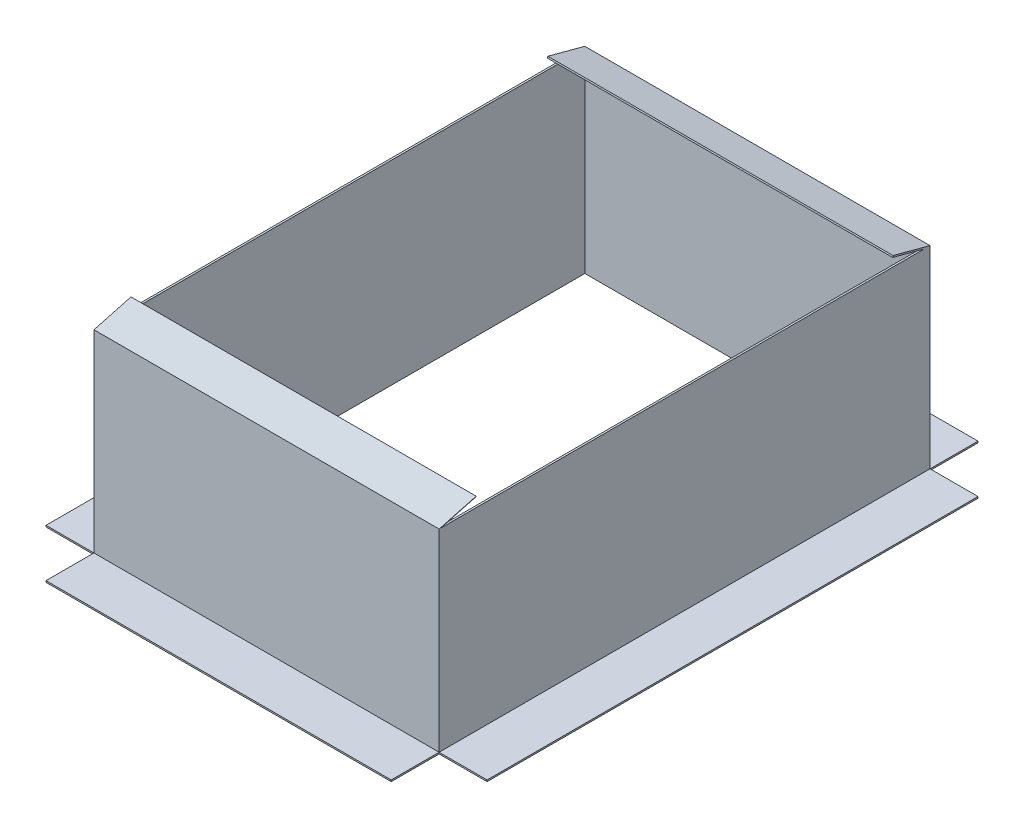
ISO-10303-21;
HEADER;
FILE_DESCRIPTION(('STEP AP214'),'2;1');
FILE_NAME('part.step','',(''),(''),'','','');
FILE_SCHEMA(('AUTOMOTIVE_DESIGN { 1 0 10303 214 1 1 1 1 }'));
ENDSEC;
DATA;
#1=APPLICATION_CONTEXT('core data for automotive mechanical design processes');
#2=APPLICATION_PROTOCOL_DEFINITION('international standard','automotive_design',2000,#1);
#3=PRODUCT_CONTEXT('',#1,'mechanical');
#4=PRODUCT('Part','Part','',(#3));
#5=PRODUCT_RELATED_PRODUCT_CATEGORY('part','',(#4));
#6=PRODUCT_DEFINITION_FORMATION('','',#4);
#7=PRODUCT_DEFINITION_CONTEXT('part definition',#1,'design');
#8=PRODUCT_DEFINITION('design','',#6,#7);
#9=PRODUCT_DEFINITION_SHAPE('','',#8);
#10=(LENGTH_UNIT() NAMED_UNIT(*) SI_UNIT(.MILLI.,.METRE.));
#11=(NAMED_UNIT(*) PLANE_ANGLE_UNIT() SI_UNIT($,.RADIAN.));
#12=(NAMED_UNIT(*) SI_UNIT($,.STERADIAN.) SOLID_ANGLE_UNIT());
#13=UNCERTAINTY_MEASURE_WITH_UNIT(LENGTH_MEASURE(1.E-05),#10,'distance_accuracy_value','');
#14=(GEOMETRIC_REPRESENTATION_CONTEXT(3) GLOBAL_UNCERTAINTY_ASSIGNED_CONTEXT((#13)) GLOBAL_UNIT_ASSIGNED_CONTEXT((#10,
#11,#12)) REPRESENTATION_CONTEXT('',''));
#15=CARTESIAN_POINT('',(0.,0.,0.));
#16=DIRECTION('',(0.,0.,1.));
#17=DIRECTION('',(1.,0.,0.));
#18=AXIS2_PLACEMENT_3D('',#15,#16,#17);
#19=CARTESIAN_POINT('',(0.,101.6,0.));
#20=DIRECTION('',(0.,1.,0.));
#21=DIRECTION('',(0.,0.,1.));
#22=AXIS2_PLACEMENT_3D('',#19,#20,#21);
#23=PLANE('',#22);
#24=DIRECTION('',(1.,0.,0.));
#25=VECTOR('',#24,1.);
#26=CARTESIAN_POINT('',(-110.200071085794,101.6,-124.909037355743));
#27=LINE('',#26,#25);
#28=CARTESIAN_POINT('',(-90.,101.6,-124.909037355743));
#29=VERTEX_POINT('',#28);
#30=CARTESIAN_POINT('',(-89.,101.6,-124.909037355743));
#31=VERTEX_POINT('',#30);
#32=EDGE_CURVE('E52',#29,#31,#27,.T.);
#33=ORIENTED_EDGE('',*,*,#32,.F.);
#34=DIRECTION('',(0.,0.,1.));
#35=VECTOR('',#34,1.);
#36=CARTESIAN_POINT('',(-90.,101.6,0.));
#37=LINE('',#36,#35);
#38=CARTESIAN_POINT('',(-90.0000000000001,101.6,127.2));
#39=VERTEX_POINT('',#38);
#40=EDGE_CURVE('E367',#29,#39,#37,.T.);
#41=ORIENTED_EDGE('',*,*,#40,.T.);
#42=DIRECTION('',(1.,0.,0.));
#43=VECTOR('',#42,1.);
#44=CARTESIAN_POINT('',(-110.200071085794,101.6,127.2));
#45=LINE('',#44,#43);
#46=CARTESIAN_POINT('',(90.,101.6,127.2));
#47=VERTEX_POINT('',#46);
#48=EDGE_CURVE('E259',#39,#47,#45,.T.);
#49=ORIENTED_EDGE('',*,*,#48,.T.);
#50=DIRECTION('',(0.,0.,-1.));
#51=VECTOR('',#50,1.);
#52=CARTESIAN_POINT('',(90.,101.6,0.));
#53=LINE('',#52,#51);
#54=CARTESIAN_POINT('',(90.,101.6,-124.909037355743));
#55=VERTEX_POINT('',#54);
#56=EDGE_CURVE('E59',#47,#55,#53,.T.);
#57=ORIENTED_EDGE('',*,*,#56,.T.);
#58=CARTESIAN_POINT('',(89.,101.6,-124.909037355743));
#59=VERTEX_POINT('',#58);
#60=EDGE_CURVE('E233',#59,#55,#27,.T.);
#61=ORIENTED_EDGE('',*,*,#60,.F.);
#62=DIRECTION('',(0.,0.,1.));
#63=VECTOR('',#62,1.);
#64=CARTESIAN_POINT('',(89.,101.6,0.));
#65=LINE('',#64,#63);
#66=CARTESIAN_POINT('',(89.,101.6,127.));
#67=VERTEX_POINT('',#66);
#68=EDGE_CURVE('E376',#59,#67,#65,.T.);
#69=ORIENTED_EDGE('',*,*,#68,.T.);
#70=DIRECTION('',(-1.,0.,0.));
#71=VECTOR('',#70,1.);
#72=CARTESIAN_POINT('',(0.,101.6,127.));
#73=LINE('',#72,#71);
#74=CARTESIAN_POINT('',(-89.,101.6,127.));
#75=VERTEX_POINT('',#74);
#76=EDGE_CURVE('E380',#67,#75,#73,.T.);
#77=ORIENTED_EDGE('',*,*,#76,.T.);
#78=DIRECTION('',(0.,0.,-1.));
#79=VECTOR('',#78,1.);
#80=CARTESIAN_POINT('',(-89.,101.6,0.));
#81=LINE('',#80,#79);
#82=EDGE_CURVE('E383',#75,#31,#81,.T.);
#83=ORIENTED_EDGE('',*,*,#82,.T.);
#84=EDGE_LOOP('',(#33,#41,#49,#57,#61,#69,#77,#83));
#85=FACE_BOUND('',#84,.T.);
#86=ADVANCED_FACE('F35',(#85),#23,.T.);
#87=CARTESIAN_POINT('',(-90.,101.6,0.));
#88=DIRECTION('',(1.,0.,0.));
#89=DIRECTION('',(0.,0.,-1.));
#90=AXIS2_PLACEMENT_3D('',#87,#88,#89);
#91=PLANE('',#90);
#92=DIRECTION('',(0.,-1.,0.));
#93=VECTOR('',#92,1.);
#94=CARTESIAN_POINT('',(-90.,0.8,-128.));
#95=LINE('',#94,#93);
#96=CARTESIAN_POINT('',(-90.,0.8,-128.));
#97=VERTEX_POINT('',#96);
#98=CARTESIAN_POINT('',(-90.,0.,-128.));
#99=VERTEX_POINT('',#98);
#100=EDGE_CURVE('E270',#97,#99,#95,.T.);
#101=ORIENTED_EDGE('',*,*,#100,.F.);
#102=DIRECTION('',(0.,0.,-1.));
#103=VECTOR('',#102,1.);
#104=CARTESIAN_POINT('',(-89.9999999999999,0.8,0.));
#105=LINE('',#104,#103);
#106=CARTESIAN_POINT('',(-90.,0.8,-153.));
#107=VERTEX_POINT('',#106);
#108=EDGE_CURVE('E332',#97,#107,#105,.T.);
#109=ORIENTED_EDGE('',*,*,#108,.T.);
#110=DIRECTION('',(0.,-1.,0.));
#111=VECTOR('',#110,1.);
#112=CARTESIAN_POINT('',(-90.,0.8,-153.));
#113=LINE('',#112,#111);
#114=CARTESIAN_POINT('',(-90.,0.,-153.));
#115=VERTEX_POINT('',#114);
#116=EDGE_CURVE('E338',#107,#115,#113,.T.);
#117=ORIENTED_EDGE('',*,*,#116,.T.);
#118=DIRECTION('',(0.,0.,1.));
#119=VECTOR('',#118,1.);
#120=CARTESIAN_POINT('',(-90.,0.,0.));
#121=LINE('',#120,#119);
#122=EDGE_CURVE('E385',#115,#99,#121,.T.);
#123=ORIENTED_EDGE('',*,*,#122,.T.);
#124=EDGE_LOOP('',(#101,#109,#117,#123));
#125=FACE_BOUND('',#124,.T.);
#126=ADVANCED_FACE('F438',(#125),#91,.F.);
#127=DIRECTION('',(0.,-1.,0.));
#128=VECTOR('',#127,1.);
#129=CARTESIAN_POINT('',(-90.,101.6,-128.));
#130=LINE('',#129,#128);
#131=CARTESIAN_POINT('',(-90.,101.6,-128.));
#132=VERTEX_POINT('',#131);
#133=EDGE_CURVE('E39',#132,#97,#130,.T.);
#134=ORIENTED_EDGE('',*,*,#133,.T.);
#135=DIRECTION('',(0.,0.,1.));
#136=VECTOR('',#135,1.);
#137=CARTESIAN_POINT('',(-90.,0.8,0.));
#138=LINE('',#137,#136);
#139=CARTESIAN_POINT('',(-90.0000000000001,0.8,128.));
#140=VERTEX_POINT('',#139);
#141=EDGE_CURVE('E272',#97,#140,#138,.T.);
#142=ORIENTED_EDGE('',*,*,#141,.T.);
#143=DIRECTION('',(0.,-1.,0.));
#144=VECTOR('',#143,1.);
#145=CARTESIAN_POINT('',(-90.0000000000001,101.6,128.));
#146=LINE('',#145,#144);
#147=CARTESIAN_POINT('',(-90.0000000000001,101.6,128.));
#148=VERTEX_POINT('',#147);
#149=EDGE_CURVE('E410',#148,#140,#146,.T.);
#150=ORIENTED_EDGE('',*,*,#149,.F.);
#151=DIRECTION('',(0.,0.258819045102521,-0.965925826289069));
#152=VECTOR('',#151,1.);
#153=CARTESIAN_POINT('',(-90.0000000000001,106.77638090205,108.681483474219));
#154=LINE('',#153,#152);
#155=CARTESIAN_POINT('',(-90.0000000000001,106.77638090205,108.681483474219));
#156=VERTEX_POINT('',#155);
#157=EDGE_CURVE('E246',#148,#156,#154,.T.);
#158=ORIENTED_EDGE('',*,*,#157,.T.);
#159=DIRECTION('',(0.,-0.965925826289082,-0.258819045102471));
#160=VECTOR('',#159,1.);
#161=CARTESIAN_POINT('',(-90.0000000000001,106.57638090205,108.627893635732));
#162=LINE('',#161,#160);
#163=CARTESIAN_POINT('',(-90.0000000000001,106.57638090205,108.627893635732));
#164=VERTEX_POINT('',#163);
#165=EDGE_CURVE('E243',#156,#164,#162,.T.);
#166=ORIENTED_EDGE('',*,*,#165,.T.);
#167=DIRECTION('',(0.,-0.258819045102521,0.965925826289068));
#168=VECTOR('',#167,1.);
#169=CARTESIAN_POINT('',(-90.0000000000001,101.6,127.2));
#170=LINE('',#169,#168);
#171=EDGE_CURVE('E240',#164,#39,#170,.T.);
#172=ORIENTED_EDGE('',*,*,#171,.T.);
#173=ORIENTED_EDGE('',*,*,#40,.F.);
#174=DIRECTION('',(0.,0.258819045102521,0.965925826289068));
#175=VECTOR('',#174,1.);
#176=CARTESIAN_POINT('',(-90.,106.003640240986,-108.474428238128));
#177=LINE('',#176,#175);
#178=CARTESIAN_POINT('',(-90.,106.003640240986,-108.474428238128));
#179=VERTEX_POINT('',#178);
#180=EDGE_CURVE('E253',#29,#179,#177,.T.);
#181=ORIENTED_EDGE('',*,*,#180,.T.);
#182=DIRECTION('',(0.,0.965925826289068,-0.258819045102521));
#183=VECTOR('',#182,1.);
#184=CARTESIAN_POINT('',(-90.,106.77638090205,-108.681483474219));
#185=LINE('',#184,#183);
#186=CARTESIAN_POINT('',(-90.,106.77638090205,-108.681483474219));
#187=VERTEX_POINT('',#186);
#188=EDGE_CURVE('E480',#179,#187,#185,.T.);
#189=ORIENTED_EDGE('',*,*,#188,.T.);
#190=DIRECTION('',(0.,-0.258819045102521,-0.965925826289068));
#191=VECTOR('',#190,1.);
#192=CARTESIAN_POINT('',(-90.,101.6,-128.));
#193=LINE('',#192,#191);
#194=EDGE_CURVE('E212',#187,#132,#193,.T.);
#195=ORIENTED_EDGE('',*,*,#194,.T.);
#196=EDGE_LOOP('',(#134,#142,#150,#158,#166,#172,#173,#181,#189,#195));
#197=FACE_BOUND('',#196,.T.);
#198=ADVANCED_FACE('F417',(#197),#91,.F.);
#199=CARTESIAN_POINT('',(90.,101.6,0.));
#200=DIRECTION('',(-1.,0.,0.));
#201=DIRECTION('',(0.,0.,1.));
#202=AXIS2_PLACEMENT_3D('',#199,#200,#201);
#203=PLANE('',#202);
#204=DIRECTION('',(0.,-1.,0.));
#205=VECTOR('',#204,1.);
#206=CARTESIAN_POINT('',(90.,0.8,128.));
#207=LINE('',#206,#205);
#208=CARTESIAN_POINT('',(90.,0.8,128.));
#209=VERTEX_POINT('',#208);
#210=CARTESIAN_POINT('',(90.,0.,128.));
#211=VERTEX_POINT('',#210);
#212=EDGE_CURVE('E300',#209,#211,#207,.T.);
#213=ORIENTED_EDGE('',*,*,#212,.F.);
#214=DIRECTION('',(0.,0.,1.));
#215=VECTOR('',#214,1.);
#216=CARTESIAN_POINT('',(90.,0.8,0.));
#217=LINE('',#216,#215);
#218=CARTESIAN_POINT('',(90.,0.8,153.));
#219=VERTEX_POINT('',#218);
#220=EDGE_CURVE('E350',#209,#219,#217,.T.);
#221=ORIENTED_EDGE('',*,*,#220,.T.);
#222=DIRECTION('',(0.,-1.,0.));
#223=VECTOR('',#222,1.);
#224=CARTESIAN_POINT('',(90.,0.8,153.));
#225=LINE('',#224,#223);
#226=CARTESIAN_POINT('',(90.,0.,153.));
#227=VERTEX_POINT('',#226);
#228=EDGE_CURVE('E356',#219,#227,#225,.T.);
#229=ORIENTED_EDGE('',*,*,#228,.T.);
#230=DIRECTION('',(0.,0.,-1.));
#231=VECTOR('',#230,1.);
#232=CARTESIAN_POINT('',(90.,0.,0.));
#233=LINE('',#232,#231);
#234=EDGE_CURVE('E389',#227,#211,#233,.T.);
#235=ORIENTED_EDGE('',*,*,#234,.T.);
#236=EDGE_LOOP('',(#213,#221,#229,#235));
#237=FACE_BOUND('',#236,.T.);
#238=ADVANCED_FACE('F515',(#237),#203,.F.);
#239=DIRECTION('',(0.,-1.,0.));
#240=VECTOR('',#239,1.);
#241=CARTESIAN_POINT('',(90.,101.6,128.));
#242=LINE('',#241,#240);
#243=CARTESIAN_POINT('',(90.,101.6,128.));
#244=VERTEX_POINT('',#243);
#245=EDGE_CURVE('E409',#244,#209,#242,.T.);
#246=ORIENTED_EDGE('',*,*,#245,.T.);
#247=DIRECTION('',(0.,0.,-1.));
#248=VECTOR('',#247,1.);
#249=CARTESIAN_POINT('',(90.,0.8,0.));
#250=LINE('',#249,#248);
#251=CARTESIAN_POINT('',(90.,0.8,-128.));
#252=VERTEX_POINT('',#251);
#253=EDGE_CURVE('E302',#209,#252,#250,.T.);
#254=ORIENTED_EDGE('',*,*,#253,.T.);
#255=DIRECTION('',(0.,-1.,0.));
#256=VECTOR('',#255,1.);
#257=CARTESIAN_POINT('',(90.,101.6,-128.));
#258=LINE('',#257,#256);
#259=CARTESIAN_POINT('',(90.,101.6,-128.));
#260=VERTEX_POINT('',#259);
#261=EDGE_CURVE('E226',#260,#252,#258,.T.);
#262=ORIENTED_EDGE('',*,*,#261,.F.);
#263=DIRECTION('',(0.,0.258819045102521,0.965925826289068));
#264=VECTOR('',#263,1.);
#265=CARTESIAN_POINT('',(90.,101.6,-128.));
#266=LINE('',#265,#264);
#267=CARTESIAN_POINT('',(90.,106.77638090205,-108.681483474219));
#268=VERTEX_POINT('',#267);
#269=EDGE_CURVE('E210',#260,#268,#266,.T.);
#270=ORIENTED_EDGE('',*,*,#269,.T.);
#271=DIRECTION('',(0.,-0.965925826289068,0.258819045102521));
#272=VECTOR('',#271,1.);
#273=CARTESIAN_POINT('',(90.,106.77638090205,-108.681483474219));
#274=LINE('',#273,#272);
#275=CARTESIAN_POINT('',(90.,106.003640240986,-108.474428238128));
#276=VERTEX_POINT('',#275);
#277=EDGE_CURVE('E223',#268,#276,#274,.T.);
#278=ORIENTED_EDGE('',*,*,#277,.T.);
#279=DIRECTION('',(0.,-0.258819045102521,-0.965925826289068));
#280=VECTOR('',#279,1.);
#281=CARTESIAN_POINT('',(90.,106.003640240986,-108.474428238128));
#282=LINE('',#281,#280);
#283=EDGE_CURVE('E228',#276,#55,#282,.T.);
#284=ORIENTED_EDGE('',*,*,#283,.T.);
#285=ORIENTED_EDGE('',*,*,#56,.F.);
#286=DIRECTION('',(0.,0.258819045102521,-0.965925826289068));
#287=VECTOR('',#286,1.);
#288=CARTESIAN_POINT('',(90.,101.6,127.2));
#289=LINE('',#288,#287);
#290=CARTESIAN_POINT('',(90.,106.57638090205,108.627893635732));
#291=VERTEX_POINT('',#290);
#292=EDGE_CURVE('E252',#47,#291,#289,.T.);
#293=ORIENTED_EDGE('',*,*,#292,.T.);
#294=DIRECTION('',(0.,0.965925826289082,0.258819045102471));
#295=VECTOR('',#294,1.);
#296=CARTESIAN_POINT('',(90.,106.57638090205,108.627893635732));
#297=LINE('',#296,#295);
#298=CARTESIAN_POINT('',(90.,106.77638090205,108.681483474219));
#299=VERTEX_POINT('',#298);
#300=EDGE_CURVE('E256',#291,#299,#297,.T.);
#301=ORIENTED_EDGE('',*,*,#300,.T.);
#302=DIRECTION('',(0.,-0.258819045102521,0.965925826289068));
#303=VECTOR('',#302,1.);
#304=CARTESIAN_POINT('',(90.,106.77638090205,108.681483474219));
#305=LINE('',#304,#303);
#306=EDGE_CURVE('E249',#299,#244,#305,.T.);
#307=ORIENTED_EDGE('',*,*,#306,.T.);
#308=EDGE_LOOP('',(#246,#254,#262,#270,#278,#284,#285,#293,#301,#307));
#309=FACE_BOUND('',#308,.T.);
#310=ADVANCED_FACE('F221',(#309),#203,.F.);
#311=CARTESIAN_POINT('',(0.,101.6,-127.));
#312=DIRECTION('',(0.,0.,-1.));
#313=DIRECTION('',(-1.,0.,0.));
#314=AXIS2_PLACEMENT_3D('',#311,#312,#313);
#315=PLANE('',#314);
#316=DIRECTION('',(1.,0.,0.));
#317=VECTOR('',#316,1.);
#318=CARTESIAN_POINT('',(0.,0.,-127.));
#319=LINE('',#318,#317);
#320=CARTESIAN_POINT('',(-89.,0.,-127.));
#321=VERTEX_POINT('',#320);
#322=CARTESIAN_POINT('',(89.,0.,-127.));
#323=VERTEX_POINT('',#322);
#324=EDGE_CURVE('E392',#321,#323,#319,.T.);
#325=ORIENTED_EDGE('',*,*,#324,.T.);
#326=DIRECTION('',(0.,-1.,0.));
#327=VECTOR('',#326,1.);
#328=CARTESIAN_POINT('',(89.,101.6,-127.));
#329=LINE('',#328,#327);
#330=CARTESIAN_POINT('',(89.,101.6,-127.));
#331=VERTEX_POINT('',#330);
#332=EDGE_CURVE('E11',#331,#323,#329,.T.);
#333=ORIENTED_EDGE('',*,*,#332,.F.);
#334=DIRECTION('',(1.,0.,0.));
#335=VECTOR('',#334,1.);
#336=CARTESIAN_POINT('',(0.,101.6,-127.));
#337=LINE('',#336,#335);
#338=CARTESIAN_POINT('',(-89.,101.6,-127.));
#339=VERTEX_POINT('',#338);
#340=EDGE_CURVE('E373',#339,#331,#337,.T.);
#341=ORIENTED_EDGE('',*,*,#340,.F.);
#342=DIRECTION('',(0.,-1.,0.));
#343=VECTOR('',#342,1.);
#344=CARTESIAN_POINT('',(-89.,101.6,-127.));
#345=LINE('',#344,#343);
#346=EDGE_CURVE('E400',#339,#321,#345,.T.);
#347=ORIENTED_EDGE('',*,*,#346,.T.);
#348=EDGE_LOOP('',(#325,#333,#341,#347));
#349=FACE_BOUND('',#348,.T.);
#350=ADVANCED_FACE('F495',(#349),#315,.F.);
#351=CARTESIAN_POINT('',(89.,101.6,0.));
#352=DIRECTION('',(1.,0.,0.));
#353=DIRECTION('',(0.,0.,-1.));
#354=AXIS2_PLACEMENT_3D('',#351,#352,#353);
#355=PLANE('',#354);
#356=DIRECTION('',(0.,0.,1.));
#357=VECTOR('',#356,1.);
#358=CARTESIAN_POINT('',(89.,0.,0.));
#359=LINE('',#358,#357);
#360=CARTESIAN_POINT('',(89.,0.,127.));
#361=VERTEX_POINT('',#360);
#362=EDGE_CURVE('E395',#323,#361,#359,.T.);
#363=ORIENTED_EDGE('',*,*,#362,.T.);
#364=DIRECTION('',(0.,-1.,0.));
#365=VECTOR('',#364,1.);
#366=CARTESIAN_POINT('',(89.,101.6,127.));
#367=LINE('',#366,#365);
#368=EDGE_CURVE('E44',#67,#361,#367,.T.);
#369=ORIENTED_EDGE('',*,*,#368,.F.);
#370=ORIENTED_EDGE('',*,*,#68,.F.);
#371=EDGE_CURVE('E377',#331,#59,#65,.T.);
#372=ORIENTED_EDGE('',*,*,#371,.F.);
#373=ORIENTED_EDGE('',*,*,#332,.T.);
#374=EDGE_LOOP('',(#363,#369,#370,#372,#373));
#375=FACE_BOUND('',#374,.T.);
#376=ADVANCED_FACE('F492',(#375),#355,.F.);
#377=CARTESIAN_POINT('',(0.,101.6,127.));
#378=DIRECTION('',(0.,0.,1.));
#379=DIRECTION('',(1.,0.,0.));
#380=AXIS2_PLACEMENT_3D('',#377,#378,#379);
#381=PLANE('',#380);
#382=DIRECTION('',(-1.,0.,0.));
#383=VECTOR('',#382,1.);
#384=CARTESIAN_POINT('',(0.,0.,127.));
#385=LINE('',#384,#383);
#386=CARTESIAN_POINT('',(-89.,0.,127.));
#387=VERTEX_POINT('',#386);
#388=EDGE_CURVE('E397',#361,#387,#385,.T.);
#389=ORIENTED_EDGE('',*,*,#388,.T.);
#390=DIRECTION('',(0.,-1.,0.));
#391=VECTOR('',#390,1.);
#392=CARTESIAN_POINT('',(-89.,101.6,127.));
#393=LINE('',#392,#391);
#394=EDGE_CURVE('E403',#75,#387,#393,.T.);
#395=ORIENTED_EDGE('',*,*,#394,.F.);
#396=ORIENTED_EDGE('',*,*,#76,.F.);
#397=ORIENTED_EDGE('',*,*,#368,.T.);
#398=EDGE_LOOP('',(#389,#395,#396,#397));
#399=FACE_BOUND('',#398,.T.);
#400=ADVANCED_FACE('F502',(#399),#381,.F.);
#401=CARTESIAN_POINT('',(0.,101.6,-128.));
#402=DIRECTION('',(0.,0.,1.));
#403=DIRECTION('',(1.,0.,0.));
#404=AXIS2_PLACEMENT_3D('',#401,#402,#403);
#405=PLANE('',#404);
#406=ORIENTED_EDGE('',*,*,#261,.T.);
#407=DIRECTION('',(-1.,0.,0.));
#408=VECTOR('',#407,1.);
#409=CARTESIAN_POINT('',(0.,0.8,-128.));
#410=LINE('',#409,#408);
#411=EDGE_CURVE('E329',#252,#97,#410,.T.);
#412=ORIENTED_EDGE('',*,*,#411,.T.);
#413=ORIENTED_EDGE('',*,*,#133,.F.);
#414=DIRECTION('',(-1.,0.,0.));
#415=VECTOR('',#414,1.);
#416=CARTESIAN_POINT('',(0.,101.6,-128.));
#417=LINE('',#416,#415);
#418=EDGE_CURVE('E365',#260,#132,#417,.T.);
#419=ORIENTED_EDGE('',*,*,#418,.F.);
#420=EDGE_LOOP('',(#406,#412,#413,#419));
#421=FACE_BOUND('',#420,.T.);
#422=ADVANCED_FACE('F37',(#421),#405,.F.);
#423=DIRECTION('',(0.,0.,-1.));
#424=VECTOR('',#423,1.);
#425=CARTESIAN_POINT('',(-90.0000000000001,0.8,0.));
#426=LINE('',#425,#424);
#427=CARTESIAN_POINT('',(-90.,0.8,153.));
#428=VERTEX_POINT('',#427);
#429=EDGE_CURVE('E344',#428,#140,#426,.T.);
#430=ORIENTED_EDGE('',*,*,#429,.T.);
#431=DIRECTION('',(0.,-1.,0.));
#432=VECTOR('',#431,1.);
#433=CARTESIAN_POINT('',(-90.0000000000001,0.8,128.));
#434=LINE('',#433,#432);
#435=CARTESIAN_POINT('',(-90.0000000000001,0.,128.));
#436=VERTEX_POINT('',#435);
#437=EDGE_CURVE('E271',#140,#436,#434,.T.);
#438=ORIENTED_EDGE('',*,*,#437,.T.);
#439=CARTESIAN_POINT('',(-90.,0.,153.));
#440=VERTEX_POINT('',#439);
#441=EDGE_CURVE('E362',#436,#440,#121,.T.);
#442=ORIENTED_EDGE('',*,*,#441,.T.);
#443=DIRECTION('',(0.,-1.,0.));
#444=VECTOR('',#443,1.);
#445=CARTESIAN_POINT('',(-90.,0.8,153.));
#446=LINE('',#445,#444);
#447=EDGE_CURVE('E359',#428,#440,#446,.T.);
#448=ORIENTED_EDGE('',*,*,#447,.F.);
#449=EDGE_LOOP('',(#430,#438,#442,#448));
#450=FACE_BOUND('',#449,.T.);
#451=ADVANCED_FACE('F453',(#450),#91,.F.);
#452=CARTESIAN_POINT('',(0.,101.6,128.));
#453=DIRECTION('',(0.,0.,-1.));
#454=DIRECTION('',(-1.,0.,0.));
#455=AXIS2_PLACEMENT_3D('',#452,#453,#454);
#456=PLANE('',#455);
#457=ORIENTED_EDGE('',*,*,#149,.T.);
#458=DIRECTION('',(1.,0.,0.));
#459=VECTOR('',#458,1.);
#460=CARTESIAN_POINT('',(0.,0.8,128.));
#461=LINE('',#460,#459);
#462=EDGE_CURVE('E347',#140,#209,#461,.T.);
#463=ORIENTED_EDGE('',*,*,#462,.T.);
#464=ORIENTED_EDGE('',*,*,#245,.F.);
#465=DIRECTION('',(1.,0.,0.));
#466=VECTOR('',#465,1.);
#467=CARTESIAN_POINT('',(0.,101.6,128.));
#468=LINE('',#467,#466);
#469=EDGE_CURVE('E370',#148,#244,#468,.T.);
#470=ORIENTED_EDGE('',*,*,#469,.F.);
#471=EDGE_LOOP('',(#457,#463,#464,#470));
#472=FACE_BOUND('',#471,.T.);
#473=ADVANCED_FACE('F463',(#472),#456,.F.);
#474=DIRECTION('',(0.,0.,1.));
#475=VECTOR('',#474,1.);
#476=CARTESIAN_POINT('',(90.,0.8,0.));
#477=LINE('',#476,#475);
#478=CARTESIAN_POINT('',(90.,0.8,-153.));
#479=VERTEX_POINT('',#478);
#480=EDGE_CURVE('E326',#479,#252,#477,.T.);
#481=ORIENTED_EDGE('',*,*,#480,.T.);
#482=DIRECTION('',(0.,-1.,0.));
#483=VECTOR('',#482,1.);
#484=CARTESIAN_POINT('',(90.,0.8,-128.));
#485=LINE('',#484,#483);
#486=CARTESIAN_POINT('',(90.,0.,-128.));
#487=VERTEX_POINT('',#486);
#488=EDGE_CURVE('E301',#252,#487,#485,.T.);
#489=ORIENTED_EDGE('',*,*,#488,.T.);
#490=CARTESIAN_POINT('',(90.,0.,-153.));
#491=VERTEX_POINT('',#490);
#492=EDGE_CURVE('E388',#487,#491,#233,.T.);
#493=ORIENTED_EDGE('',*,*,#492,.T.);
#494=DIRECTION('',(0.,-1.,0.));
#495=VECTOR('',#494,1.);
#496=CARTESIAN_POINT('',(90.,0.8,-153.));
#497=LINE('',#496,#495);
#498=EDGE_CURVE('E335',#479,#491,#497,.T.);
#499=ORIENTED_EDGE('',*,*,#498,.F.);
#500=EDGE_LOOP('',(#481,#489,#493,#499));
#501=FACE_BOUND('',#500,.T.);
#502=ADVANCED_FACE('F427',(#501),#203,.F.);
#503=CARTESIAN_POINT('',(-89.,101.6,0.));
#504=DIRECTION('',(-1.,0.,0.));
#505=DIRECTION('',(0.,0.,1.));
#506=AXIS2_PLACEMENT_3D('',#503,#504,#505);
#507=PLANE('',#506);
#508=DIRECTION('',(0.,0.,-1.));
#509=VECTOR('',#508,1.);
#510=CARTESIAN_POINT('',(-89.,0.,0.));
#511=LINE('',#510,#509);
#512=EDGE_CURVE('E368',#387,#321,#511,.T.);
#513=ORIENTED_EDGE('',*,*,#512,.T.);
#514=ORIENTED_EDGE('',*,*,#346,.F.);
#515=EDGE_CURVE('E382',#31,#339,#81,.T.);
#516=ORIENTED_EDGE('',*,*,#515,.F.);
#517=ORIENTED_EDGE('',*,*,#82,.F.);
#518=ORIENTED_EDGE('',*,*,#394,.T.);
#519=EDGE_LOOP('',(#513,#514,#516,#517,#518));
#520=FACE_BOUND('',#519,.T.);
#521=ADVANCED_FACE('F506',(#520),#507,.F.);
#522=CARTESIAN_POINT('',(0.,0.,0.));
#523=DIRECTION('',(0.,1.,0.));
#524=DIRECTION('',(0.,0.,1.));
#525=AXIS2_PLACEMENT_3D('',#522,#523,#524);
#526=PLANE('',#525);
#527=ORIENTED_EDGE('',*,*,#122,.F.);
#528=DIRECTION('',(1.,0.,0.));
#529=VECTOR('',#528,1.);
#530=CARTESIAN_POINT('',(0.,0.,-153.));
#531=LINE('',#530,#529);
#532=EDGE_CURVE('E317',#115,#491,#531,.T.);
#533=ORIENTED_EDGE('',*,*,#532,.T.);
#534=ORIENTED_EDGE('',*,*,#492,.F.);
#535=DIRECTION('',(1.,0.,0.));
#536=VECTOR('',#535,1.);
#537=CARTESIAN_POINT('',(0.,0.,-128.));
#538=LINE('',#537,#536);
#539=CARTESIAN_POINT('',(115.,0.,-128.));
#540=VERTEX_POINT('',#539);
#541=EDGE_CURVE('E314',#487,#540,#538,.T.);
#542=ORIENTED_EDGE('',*,*,#541,.T.);
#543=DIRECTION('',(0.,0.,1.));
#544=VECTOR('',#543,1.);
#545=CARTESIAN_POINT('',(115.,0.,0.));
#546=LINE('',#545,#544);
#547=CARTESIAN_POINT('',(115.,0.,128.));
#548=VERTEX_POINT('',#547);
#549=EDGE_CURVE('E308',#540,#548,#546,.T.);
#550=ORIENTED_EDGE('',*,*,#549,.T.);
#551=DIRECTION('',(-1.,0.,0.));
#552=VECTOR('',#551,1.);
#553=CARTESIAN_POINT('',(0.,0.,128.));
#554=LINE('',#553,#552);
#555=EDGE_CURVE('E311',#548,#211,#554,.T.);
#556=ORIENTED_EDGE('',*,*,#555,.T.);
#557=ORIENTED_EDGE('',*,*,#234,.F.);
#558=DIRECTION('',(-1.,0.,0.));
#559=VECTOR('',#558,1.);
#560=CARTESIAN_POINT('',(0.,0.,153.));
#561=LINE('',#560,#559);
#562=EDGE_CURVE('E341',#227,#440,#561,.T.);
#563=ORIENTED_EDGE('',*,*,#562,.T.);
#564=ORIENTED_EDGE('',*,*,#441,.F.);
#565=DIRECTION('',(-1.,0.,0.));
#566=VECTOR('',#565,1.);
#567=CARTESIAN_POINT('',(-1.4210854715202E-13,0.,128.));
#568=LINE('',#567,#566);
#569=CARTESIAN_POINT('',(-115.,0.,128.));
#570=VERTEX_POINT('',#569);
#571=EDGE_CURVE('E285',#436,#570,#568,.T.);
#572=ORIENTED_EDGE('',*,*,#571,.T.);
#573=DIRECTION('',(0.,0.,-1.));
#574=VECTOR('',#573,1.);
#575=CARTESIAN_POINT('',(-115.,0.,0.));
#576=LINE('',#575,#574);
#577=CARTESIAN_POINT('',(-115.,0.,-128.));
#578=VERTEX_POINT('',#577);
#579=EDGE_CURVE('E279',#570,#578,#576,.T.);
#580=ORIENTED_EDGE('',*,*,#579,.T.);
#581=DIRECTION('',(1.,0.,0.));
#582=VECTOR('',#581,1.);
#583=CARTESIAN_POINT('',(-1.4210854715202E-13,0.,-128.));
#584=LINE('',#583,#582);
#585=EDGE_CURVE('E282',#578,#99,#584,.T.);
#586=ORIENTED_EDGE('',*,*,#585,.T.);
#587=EDGE_LOOP('',(#527,#533,#534,#542,#550,#556,#557,#563,#564,#572,#580,#586));
#588=FACE_BOUND('',#587,.T.);
#589=ORIENTED_EDGE('',*,*,#324,.F.);
#590=ORIENTED_EDGE('',*,*,#512,.F.);
#591=ORIENTED_EDGE('',*,*,#388,.F.);
#592=ORIENTED_EDGE('',*,*,#362,.F.);
#593=EDGE_LOOP('',(#589,#590,#591,#592));
#594=FACE_BOUND('',#593,.T.);
#595=ADVANCED_FACE('F433',(#588,#594),#526,.F.);
#596=CARTESIAN_POINT('',(0.,0.8,153.));
#597=DIRECTION('',(0.,0.,1.));
#598=DIRECTION('',(1.,0.,0.));
#599=AXIS2_PLACEMENT_3D('',#596,#597,#598);
#600=PLANE('',#599);
#601=ORIENTED_EDGE('',*,*,#562,.F.);
#602=ORIENTED_EDGE('',*,*,#228,.F.);
#603=DIRECTION('',(-1.,0.,0.));
#604=VECTOR('',#603,1.);
#605=CARTESIAN_POINT('',(0.,0.8,153.));
#606=LINE('',#605,#604);
#607=EDGE_CURVE('E353',#219,#428,#606,.T.);
#608=ORIENTED_EDGE('',*,*,#607,.T.);
#609=ORIENTED_EDGE('',*,*,#447,.T.);
#610=EDGE_LOOP('',(#601,#602,#608,#609));
#611=FACE_BOUND('',#610,.T.);
#612=ADVANCED_FACE('F457',(#611),#600,.T.);
#613=CARTESIAN_POINT('',(0.,0.8,0.));
#614=DIRECTION('',(0.,-1.,0.));
#615=DIRECTION('',(0.,0.,-1.));
#616=AXIS2_PLACEMENT_3D('',#613,#614,#615);
#617=PLANE('',#616);
#618=ORIENTED_EDGE('',*,*,#429,.F.);
#619=ORIENTED_EDGE('',*,*,#607,.F.);
#620=ORIENTED_EDGE('',*,*,#220,.F.);
#621=ORIENTED_EDGE('',*,*,#462,.F.);
#622=EDGE_LOOP('',(#618,#619,#620,#621));
#623=FACE_BOUND('',#622,.T.);
#624=ADVANCED_FACE('F460',(#623),#617,.F.);
#625=CARTESIAN_POINT('',(0.,0.8,-153.));
#626=DIRECTION('',(0.,0.,-1.));
#627=DIRECTION('',(-1.,0.,0.));
#628=AXIS2_PLACEMENT_3D('',#625,#626,#627);
#629=PLANE('',#628);
#630=ORIENTED_EDGE('',*,*,#532,.F.);
#631=ORIENTED_EDGE('',*,*,#116,.F.);
#632=DIRECTION('',(1.,0.,0.));
#633=VECTOR('',#632,1.);
#634=CARTESIAN_POINT('',(0.,0.8,-153.));
#635=LINE('',#634,#633);
#636=EDGE_CURVE('E323',#107,#479,#635,.T.);
#637=ORIENTED_EDGE('',*,*,#636,.T.);
#638=ORIENTED_EDGE('',*,*,#498,.T.);
#639=EDGE_LOOP('',(#630,#631,#637,#638));
#640=FACE_BOUND('',#639,.T.);
#641=ADVANCED_FACE('F431',(#640),#629,.T.);
#642=CARTESIAN_POINT('',(0.,0.8,0.));
#643=DIRECTION('',(0.,-1.,0.));
#644=DIRECTION('',(0.,0.,-1.));
#645=AXIS2_PLACEMENT_3D('',#642,#643,#644);
#646=PLANE('',#645);
#647=ORIENTED_EDGE('',*,*,#636,.F.);
#648=ORIENTED_EDGE('',*,*,#108,.F.);
#649=ORIENTED_EDGE('',*,*,#411,.F.);
#650=ORIENTED_EDGE('',*,*,#480,.F.);
#651=EDGE_LOOP('',(#647,#648,#649,#650));
#652=FACE_BOUND('',#651,.T.);
#653=ADVANCED_FACE('F425',(#652),#646,.F.);
#654=CARTESIAN_POINT('',(115.,0.8,0.));
#655=DIRECTION('',(1.,0.,0.));
#656=DIRECTION('',(0.,0.,-1.));
#657=AXIS2_PLACEMENT_3D('',#654,#655,#656);
#658=PLANE('',#657);
#659=ORIENTED_EDGE('',*,*,#549,.F.);
#660=DIRECTION('',(0.,-1.,0.));
#661=VECTOR('',#660,1.);
#662=CARTESIAN_POINT('',(115.,0.8,-128.));
#663=LINE('',#662,#661);
#664=CARTESIAN_POINT('',(115.,0.8,-128.));
#665=VERTEX_POINT('',#664);
#666=EDGE_CURVE('E304',#665,#540,#663,.T.);
#667=ORIENTED_EDGE('',*,*,#666,.F.);
#668=DIRECTION('',(0.,0.,1.));
#669=VECTOR('',#668,1.);
#670=CARTESIAN_POINT('',(115.,0.8,0.));
#671=LINE('',#670,#669);
#672=CARTESIAN_POINT('',(115.,0.8,128.));
#673=VERTEX_POINT('',#672);
#674=EDGE_CURVE('E288',#665,#673,#671,.T.);
#675=ORIENTED_EDGE('',*,*,#674,.T.);
#676=DIRECTION('',(0.,-1.,0.));
#677=VECTOR('',#676,1.);
#678=CARTESIAN_POINT('',(115.,0.8,128.));
#679=LINE('',#678,#677);
#680=EDGE_CURVE('E296',#673,#548,#679,.T.);
#681=ORIENTED_EDGE('',*,*,#680,.T.);
#682=EDGE_LOOP('',(#659,#667,#675,#681));
#683=FACE_BOUND('',#682,.T.);
#684=ADVANCED_FACE('F531',(#683),#658,.T.);
#685=CARTESIAN_POINT('',(0.,0.8,-128.));
#686=DIRECTION('',(0.,0.,-1.));
#687=DIRECTION('',(-1.,0.,0.));
#688=AXIS2_PLACEMENT_3D('',#685,#686,#687);
#689=PLANE('',#688);
#690=ORIENTED_EDGE('',*,*,#541,.F.);
#691=ORIENTED_EDGE('',*,*,#488,.F.);
#692=DIRECTION('',(1.,0.,0.));
#693=VECTOR('',#692,1.);
#694=CARTESIAN_POINT('',(0.,0.8,-128.));
#695=LINE('',#694,#693);
#696=EDGE_CURVE('E305',#252,#665,#695,.T.);
#697=ORIENTED_EDGE('',*,*,#696,.T.);
#698=ORIENTED_EDGE('',*,*,#666,.T.);
#699=EDGE_LOOP('',(#690,#691,#697,#698));
#700=FACE_BOUND('',#699,.T.);
#701=ADVANCED_FACE('F534',(#700),#689,.T.);
#702=CARTESIAN_POINT('',(0.,0.8,128.));
#703=DIRECTION('',(0.,0.,1.));
#704=DIRECTION('',(1.,0.,0.));
#705=AXIS2_PLACEMENT_3D('',#702,#703,#704);
#706=PLANE('',#705);
#707=ORIENTED_EDGE('',*,*,#555,.F.);
#708=ORIENTED_EDGE('',*,*,#680,.F.);
#709=DIRECTION('',(-1.,0.,0.));
#710=VECTOR('',#709,1.);
#711=CARTESIAN_POINT('',(0.,0.8,128.));
#712=LINE('',#711,#710);
#713=EDGE_CURVE('E297',#673,#209,#712,.T.);
#714=ORIENTED_EDGE('',*,*,#713,.T.);
#715=ORIENTED_EDGE('',*,*,#212,.T.);
#716=EDGE_LOOP('',(#707,#708,#714,#715));
#717=FACE_BOUND('',#716,.T.);
#718=ADVANCED_FACE('F536',(#717),#706,.T.);
#719=CARTESIAN_POINT('',(0.,0.8,0.));
#720=DIRECTION('',(0.,-1.,0.));
#721=DIRECTION('',(0.,0.,-1.));
#722=AXIS2_PLACEMENT_3D('',#719,#720,#721);
#723=PLANE('',#722);
#724=ORIENTED_EDGE('',*,*,#674,.F.);
#725=ORIENTED_EDGE('',*,*,#696,.F.);
#726=ORIENTED_EDGE('',*,*,#253,.F.);
#727=ORIENTED_EDGE('',*,*,#713,.F.);
#728=EDGE_LOOP('',(#724,#725,#726,#727));
#729=FACE_BOUND('',#728,.T.);
#730=ADVANCED_FACE('F539',(#729),#723,.F.);
#731=CARTESIAN_POINT('',(-115.,0.8,0.));
#732=DIRECTION('',(-1.,0.,0.));
#733=DIRECTION('',(0.,0.,1.));
#734=AXIS2_PLACEMENT_3D('',#731,#732,#733);
#735=PLANE('',#734);
#736=ORIENTED_EDGE('',*,*,#579,.F.);
#737=DIRECTION('',(0.,-1.,0.));
#738=VECTOR('',#737,1.);
#739=CARTESIAN_POINT('',(-115.,0.8,128.));
#740=LINE('',#739,#738);
#741=CARTESIAN_POINT('',(-115.,0.8,128.));
#742=VERTEX_POINT('',#741);
#743=EDGE_CURVE('E275',#742,#570,#740,.T.);
#744=ORIENTED_EDGE('',*,*,#743,.F.);
#745=DIRECTION('',(0.,0.,-1.));
#746=VECTOR('',#745,1.);
#747=CARTESIAN_POINT('',(-115.,0.8,0.));
#748=LINE('',#747,#746);
#749=CARTESIAN_POINT('',(-115.,0.8,-128.));
#750=VERTEX_POINT('',#749);
#751=EDGE_CURVE('E248',#742,#750,#748,.T.);
#752=ORIENTED_EDGE('',*,*,#751,.T.);
#753=DIRECTION('',(0.,-1.,0.));
#754=VECTOR('',#753,1.);
#755=CARTESIAN_POINT('',(-115.,0.8,-128.));
#756=LINE('',#755,#754);
#757=EDGE_CURVE('E266',#750,#578,#756,.T.);
#758=ORIENTED_EDGE('',*,*,#757,.T.);
#759=EDGE_LOOP('',(#736,#744,#752,#758));
#760=FACE_BOUND('',#759,.T.);
#761=ADVANCED_FACE('F448',(#760),#735,.T.);
#762=CARTESIAN_POINT('',(-1.4210854715202E-13,0.8,128.));
#763=DIRECTION('',(0.,0.,1.));
#764=DIRECTION('',(1.,0.,0.));
#765=AXIS2_PLACEMENT_3D('',#762,#763,#764);
#766=PLANE('',#765);
#767=ORIENTED_EDGE('',*,*,#571,.F.);
#768=ORIENTED_EDGE('',*,*,#437,.F.);
#769=DIRECTION('',(-1.,0.,0.));
#770=VECTOR('',#769,1.);
#771=CARTESIAN_POINT('',(-1.4210854715202E-13,0.8,128.));
#772=LINE('',#771,#770);
#773=EDGE_CURVE('E276',#140,#742,#772,.T.);
#774=ORIENTED_EDGE('',*,*,#773,.T.);
#775=ORIENTED_EDGE('',*,*,#743,.T.);
#776=EDGE_LOOP('',(#767,#768,#774,#775));
#777=FACE_BOUND('',#776,.T.);
#778=ADVANCED_FACE('F450',(#777),#766,.T.);
#779=CARTESIAN_POINT('',(-1.4210854715202E-13,0.8,-128.));
#780=DIRECTION('',(0.,0.,-1.));
#781=DIRECTION('',(-1.,0.,0.));
#782=AXIS2_PLACEMENT_3D('',#779,#780,#781);
#783=PLANE('',#782);
#784=ORIENTED_EDGE('',*,*,#585,.F.);
#785=ORIENTED_EDGE('',*,*,#757,.F.);
#786=DIRECTION('',(1.,0.,0.));
#787=VECTOR('',#786,1.);
#788=CARTESIAN_POINT('',(-1.4210854715202E-13,0.8,-128.));
#789=LINE('',#788,#787);
#790=EDGE_CURVE('E267',#750,#97,#789,.T.);
#791=ORIENTED_EDGE('',*,*,#790,.T.);
#792=ORIENTED_EDGE('',*,*,#100,.T.);
#793=EDGE_LOOP('',(#784,#785,#791,#792));
#794=FACE_BOUND('',#793,.T.);
#795=ADVANCED_FACE('F440',(#794),#783,.T.);
#796=CARTESIAN_POINT('',(0.,0.8,0.));
#797=DIRECTION('',(0.,-1.,0.));
#798=DIRECTION('',(0.,0.,-1.));
#799=AXIS2_PLACEMENT_3D('',#796,#797,#798);
#800=PLANE('',#799);
#801=ORIENTED_EDGE('',*,*,#751,.F.);
#802=ORIENTED_EDGE('',*,*,#773,.F.);
#803=ORIENTED_EDGE('',*,*,#141,.F.);
#804=ORIENTED_EDGE('',*,*,#790,.F.);
#805=EDGE_LOOP('',(#801,#802,#803,#804));
#806=FACE_BOUND('',#805,.T.);
#807=ADVANCED_FACE('F444',(#806),#800,.F.);
#808=CARTESIAN_POINT('',(-110.200071085794,106.77638090205,108.681483474219));
#809=DIRECTION('',(0.,0.965925826289068,0.258819045102521));
#810=DIRECTION('',(0.,-0.258819045102521,0.965925826289068));
#811=AXIS2_PLACEMENT_3D('',#808,#809,#810);
#812=PLANE('',#811);
#813=ORIENTED_EDGE('',*,*,#157,.F.);
#814=ORIENTED_EDGE('',*,*,#469,.T.);
#815=ORIENTED_EDGE('',*,*,#306,.F.);
#816=DIRECTION('',(1.,0.,0.));
#817=VECTOR('',#816,1.);
#818=CARTESIAN_POINT('',(-110.200071085794,106.77638090205,108.681483474219));
#819=LINE('',#818,#817);
#820=EDGE_CURVE('E244',#156,#299,#819,.T.);
#821=ORIENTED_EDGE('',*,*,#820,.F.);
#822=EDGE_LOOP('',(#813,#814,#815,#821));
#823=FACE_BOUND('',#822,.T.);
#824=ADVANCED_FACE('F468',(#823),#812,.T.);
#825=CARTESIAN_POINT('',(-110.200071085794,106.57638090205,108.627893635732));
#826=DIRECTION('',(0.,0.258819045102471,-0.965925826289082));
#827=DIRECTION('',(0.,0.965925826289082,0.258819045102471));
#828=AXIS2_PLACEMENT_3D('',#825,#826,#827);
#829=PLANE('',#828);
#830=ORIENTED_EDGE('',*,*,#165,.F.);
#831=ORIENTED_EDGE('',*,*,#820,.T.);
#832=ORIENTED_EDGE('',*,*,#300,.F.);
#833=DIRECTION('',(1.,0.,0.));
#834=VECTOR('',#833,1.);
#835=CARTESIAN_POINT('',(-110.200071085794,106.57638090205,108.627893635732));
#836=LINE('',#835,#834);
#837=EDGE_CURVE('E261',#164,#291,#836,.T.);
#838=ORIENTED_EDGE('',*,*,#837,.F.);
#839=EDGE_LOOP('',(#830,#831,#832,#838));
#840=FACE_BOUND('',#839,.T.);
#841=ADVANCED_FACE('F473',(#840),#829,.T.);
#842=CARTESIAN_POINT('',(-110.200071085794,101.6,127.2));
#843=DIRECTION('',(0.,-0.965925826289068,-0.258819045102521));
#844=DIRECTION('',(0.,0.258819045102521,-0.965925826289068));
#845=AXIS2_PLACEMENT_3D('',#842,#843,#844);
#846=PLANE('',#845);
#847=ORIENTED_EDGE('',*,*,#171,.F.);
#848=ORIENTED_EDGE('',*,*,#837,.T.);
#849=ORIENTED_EDGE('',*,*,#292,.F.);
#850=ORIENTED_EDGE('',*,*,#48,.F.);
#851=EDGE_LOOP('',(#847,#848,#849,#850));
#852=FACE_BOUND('',#851,.T.);
#853=ADVANCED_FACE('F475',(#852),#846,.T.);
#854=CARTESIAN_POINT('',(-110.200071085794,101.6,-124.909037355743));
#855=DIRECTION('',(0.,-1.,0.));
#856=DIRECTION('',(0.,0.,-1.));
#857=AXIS2_PLACEMENT_3D('',#854,#855,#856);
#858=PLANE('',#857);
#859=ORIENTED_EDGE('',*,*,#371,.T.);
#860=EDGE_CURVE('E235',#31,#59,#27,.T.);
#861=ORIENTED_EDGE('',*,*,#860,.F.);
#862=ORIENTED_EDGE('',*,*,#515,.T.);
#863=ORIENTED_EDGE('',*,*,#340,.T.);
#864=EDGE_LOOP('',(#859,#861,#862,#863));
#865=FACE_BOUND('',#864,.T.);
#866=ADVANCED_FACE('F488',(#865),#858,.T.);
#867=CARTESIAN_POINT('',(-110.200071085794,106.003640240986,-108.474428238128));
#868=DIRECTION('',(0.,-0.965925826289068,0.258819045102521));
#869=DIRECTION('',(0.,-0.258819045102521,-0.965925826289068));
#870=AXIS2_PLACEMENT_3D('',#867,#868,#869);
#871=PLANE('',#870);
#872=ORIENTED_EDGE('',*,*,#180,.F.);
#873=ORIENTED_EDGE('',*,*,#32,.T.);
#874=ORIENTED_EDGE('',*,*,#860,.T.);
#875=ORIENTED_EDGE('',*,*,#60,.T.);
#876=ORIENTED_EDGE('',*,*,#283,.F.);
#877=DIRECTION('',(1.,0.,0.));
#878=VECTOR('',#877,1.);
#879=CARTESIAN_POINT('',(-110.200071085794,106.003640240986,-108.474428238128));
#880=LINE('',#879,#878);
#881=EDGE_CURVE('E216',#179,#276,#880,.T.);
#882=ORIENTED_EDGE('',*,*,#881,.F.);
#883=EDGE_LOOP('',(#872,#873,#874,#875,#876,#882));
#884=FACE_BOUND('',#883,.T.);
#885=ADVANCED_FACE('F483',(#884),#871,.T.);
#886=CARTESIAN_POINT('',(-110.200071085794,106.77638090205,-108.681483474219));
#887=DIRECTION('',(0.,0.258819045102521,0.965925826289068));
#888=DIRECTION('',(0.,-0.965925826289068,0.258819045102521));
#889=AXIS2_PLACEMENT_3D('',#886,#887,#888);
#890=PLANE('',#889);
#891=ORIENTED_EDGE('',*,*,#188,.F.);
#892=ORIENTED_EDGE('',*,*,#881,.T.);
#893=ORIENTED_EDGE('',*,*,#277,.F.);
#894=DIRECTION('',(1.,0.,0.));
#895=VECTOR('',#894,1.);
#896=CARTESIAN_POINT('',(-110.200071085794,106.77638090205,-108.681483474219));
#897=LINE('',#896,#895);
#898=EDGE_CURVE('E206',#187,#268,#897,.T.);
#899=ORIENTED_EDGE('',*,*,#898,.F.);
#900=EDGE_LOOP('',(#891,#892,#893,#899));
#901=FACE_BOUND('',#900,.T.);
#902=ADVANCED_FACE('F230',(#901),#890,.T.);
#903=CARTESIAN_POINT('',(-110.200071085794,101.6,-128.));
#904=DIRECTION('',(0.,0.965925826289068,-0.258819045102521));
#905=DIRECTION('',(0.,0.258819045102521,0.965925826289068));
#906=AXIS2_PLACEMENT_3D('',#903,#904,#905);
#907=PLANE('',#906);
#908=ORIENTED_EDGE('',*,*,#194,.F.);
#909=ORIENTED_EDGE('',*,*,#898,.T.);
#910=ORIENTED_EDGE('',*,*,#269,.F.);
#911=ORIENTED_EDGE('',*,*,#418,.T.);
#912=EDGE_LOOP('',(#908,#909,#910,#911));
#913=FACE_BOUND('',#912,.T.);
#914=ADVANCED_FACE('F208',(#913),#907,.T.);
#915=CLOSED_SHELL('',(#86,#126,#198,#238,#310,#350,#376,#400,#422,#451,#473,#502,#521,#595,#612,
#624,#641,#653,#684,#701,#718,#730,#761,#778,#795,#807,#824,#841,#853,#866,#885,#902,#914));
#916=MANIFOLD_SOLID_BREP('B2',#915);
#917=ADVANCED_BREP_SHAPE_REPRESENTATION('',(#18,#916),#14);
#918=SHAPE_DEFINITION_REPRESENTATION(#9,#917);
ENDSEC;
END-ISO-10303-21;
